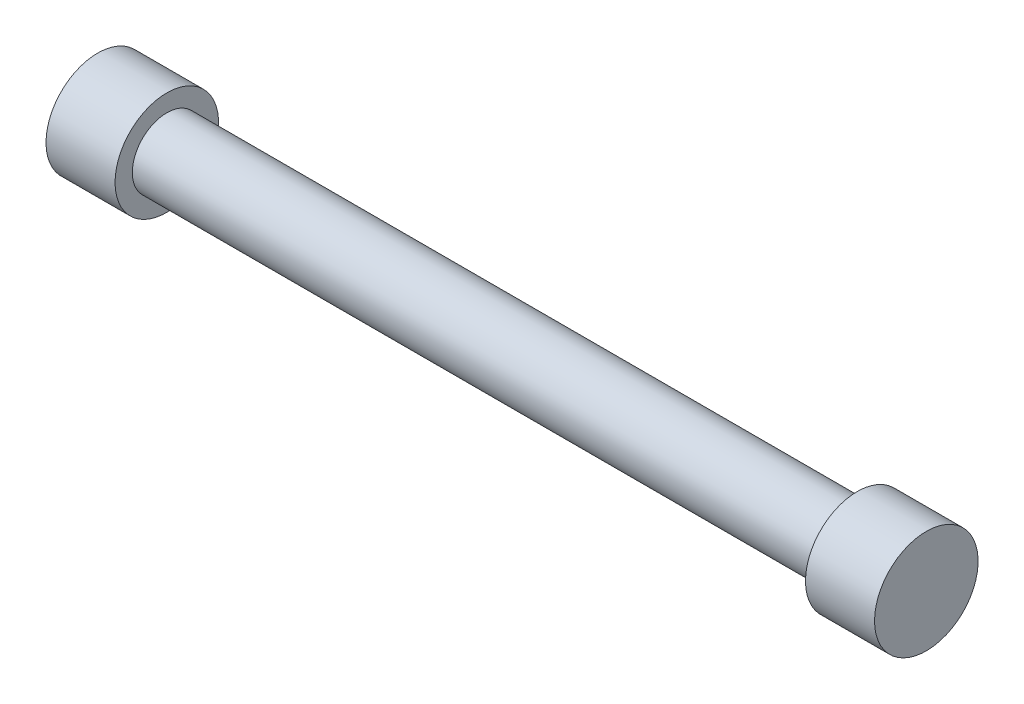
ISO-10303-21;
HEADER;
FILE_DESCRIPTION(('STEP AP214'),'2;1');
FILE_NAME('part.step','',(''),(''),'','','');
FILE_SCHEMA(('AUTOMOTIVE_DESIGN { 1 0 10303 214 1 1 1 1 }'));
ENDSEC;
DATA;
#1=APPLICATION_CONTEXT('core data for automotive mechanical design processes');
#2=APPLICATION_PROTOCOL_DEFINITION('international standard','automotive_design',2000,#1);
#3=PRODUCT_CONTEXT('',#1,'mechanical');
#4=PRODUCT('Part','Part','',(#3));
#5=PRODUCT_RELATED_PRODUCT_CATEGORY('part','',(#4));
#6=PRODUCT_DEFINITION_FORMATION('','',#4);
#7=PRODUCT_DEFINITION_CONTEXT('part definition',#1,'design');
#8=PRODUCT_DEFINITION('design','',#6,#7);
#9=PRODUCT_DEFINITION_SHAPE('','',#8);
#10=(LENGTH_UNIT() NAMED_UNIT(*) SI_UNIT(.MILLI.,.METRE.));
#11=(NAMED_UNIT(*) PLANE_ANGLE_UNIT() SI_UNIT($,.RADIAN.));
#12=(NAMED_UNIT(*) SI_UNIT($,.STERADIAN.) SOLID_ANGLE_UNIT());
#13=UNCERTAINTY_MEASURE_WITH_UNIT(LENGTH_MEASURE(1.E-05),#10,'distance_accuracy_value','');
#14=(GEOMETRIC_REPRESENTATION_CONTEXT(3) GLOBAL_UNCERTAINTY_ASSIGNED_CONTEXT((#13)) GLOBAL_UNIT_ASSIGNED_CONTEXT((#10,
#11,#12)) REPRESENTATION_CONTEXT('',''));
#15=CARTESIAN_POINT('',(0.,0.,0.));
#16=DIRECTION('',(0.,0.,1.));
#17=DIRECTION('',(1.,0.,0.));
#18=AXIS2_PLACEMENT_3D('',#15,#16,#17);
#19=CARTESIAN_POINT('',(0.,0.,0.));
#20=DIRECTION('',(-1.,0.,0.));
#21=DIRECTION('',(0.,0.,1.));
#22=AXIS2_PLACEMENT_3D('',#19,#20,#21);
#23=PLANE('',#22);
#24=CARTESIAN_POINT('',(0.,0.,0.));
#25=DIRECTION('',(-1.,0.,0.));
#26=DIRECTION('',(0.,0.,1.));
#27=AXIS2_PLACEMENT_3D('',#24,#25,#26);
#28=CIRCLE('',#27,1.5);
#29=CARTESIAN_POINT('',(0.,0.,1.5));
#30=VERTEX_POINT('',#29);
#31=EDGE_CURVE('E10',#30,#30,#28,.T.);
#32=ORIENTED_EDGE('',*,*,#31,.T.);
#33=EDGE_LOOP('',(#32));
#34=FACE_BOUND('',#33,.T.);
#35=ADVANCED_FACE('F45',(#34),#23,.T.);
#36=CARTESIAN_POINT('',(0.,0.,0.));
#37=DIRECTION('',(-1.,0.,0.));
#38=DIRECTION('',(0.,0.,1.));
#39=AXIS2_PLACEMENT_3D('',#36,#37,#38);
#40=CYLINDRICAL_SURFACE('',#39,1.5);
#41=CARTESIAN_POINT('',(2.,0.,0.));
#42=DIRECTION('',(-1.,0.,0.));
#43=DIRECTION('',(0.,0.,1.));
#44=AXIS2_PLACEMENT_3D('',#41,#42,#43);
#45=CIRCLE('',#44,1.5);
#46=CARTESIAN_POINT('',(2.,0.,1.5));
#47=VERTEX_POINT('',#46);
#48=EDGE_CURVE('E52',#47,#47,#45,.T.);
#49=ORIENTED_EDGE('',*,*,#48,.T.);
#50=EDGE_LOOP('',(#49));
#51=FACE_BOUND('',#50,.T.);
#52=ORIENTED_EDGE('',*,*,#31,.F.);
#53=EDGE_LOOP('',(#52));
#54=FACE_BOUND('',#53,.T.);
#55=ADVANCED_FACE('F89',(#51,#54),#40,.T.);
#56=CARTESIAN_POINT('',(2.,0.,1.5));
#57=DIRECTION('',(1.,0.,0.));
#58=DIRECTION('',(0.,0.,-1.));
#59=AXIS2_PLACEMENT_3D('',#56,#57,#58);
#60=PLANE('',#59);
#61=CARTESIAN_POINT('',(2.,0.,0.));
#62=DIRECTION('',(-1.,0.,0.));
#63=DIRECTION('',(0.,0.,1.));
#64=AXIS2_PLACEMENT_3D('',#61,#62,#63);
#65=CIRCLE('',#64,1.);
#66=CARTESIAN_POINT('',(2.,0.,1.));
#67=VERTEX_POINT('',#66);
#68=EDGE_CURVE('E57',#67,#67,#65,.T.);
#69=ORIENTED_EDGE('',*,*,#68,.T.);
#70=EDGE_LOOP('',(#69));
#71=FACE_BOUND('',#70,.T.);
#72=ORIENTED_EDGE('',*,*,#48,.F.);
#73=EDGE_LOOP('',(#72));
#74=FACE_BOUND('',#73,.T.);
#75=ADVANCED_FACE('F93',(#71,#74),#60,.T.);
#76=CARTESIAN_POINT('',(0.,0.,0.));
#77=DIRECTION('',(-1.,0.,0.));
#78=DIRECTION('',(0.,0.,1.));
#79=AXIS2_PLACEMENT_3D('',#76,#77,#78);
#80=CYLINDRICAL_SURFACE('',#79,1.);
#81=CARTESIAN_POINT('',(22.,0.,0.));
#82=DIRECTION('',(-1.,0.,0.));
#83=DIRECTION('',(0.,0.,1.));
#84=AXIS2_PLACEMENT_3D('',#81,#82,#83);
#85=CIRCLE('',#84,1.);
#86=CARTESIAN_POINT('',(22.,0.,1.));
#87=VERTEX_POINT('',#86);
#88=EDGE_CURVE('E62',#87,#87,#85,.T.);
#89=ORIENTED_EDGE('',*,*,#88,.T.);
#90=EDGE_LOOP('',(#89));
#91=FACE_BOUND('',#90,.T.);
#92=ORIENTED_EDGE('',*,*,#68,.F.);
#93=EDGE_LOOP('',(#92));
#94=FACE_BOUND('',#93,.T.);
#95=ADVANCED_FACE('F97',(#91,#94),#80,.T.);
#96=CARTESIAN_POINT('',(22.,0.,1.));
#97=DIRECTION('',(-1.,0.,0.));
#98=DIRECTION('',(0.,0.,1.));
#99=AXIS2_PLACEMENT_3D('',#96,#97,#98);
#100=PLANE('',#99);
#101=CARTESIAN_POINT('',(22.,0.,0.));
#102=DIRECTION('',(-1.,0.,0.));
#103=DIRECTION('',(0.,0.,1.));
#104=AXIS2_PLACEMENT_3D('',#101,#102,#103);
#105=CIRCLE('',#104,1.5);
#106=CARTESIAN_POINT('',(22.,0.,1.5));
#107=VERTEX_POINT('',#106);
#108=EDGE_CURVE('E68',#107,#107,#105,.T.);
#109=ORIENTED_EDGE('',*,*,#108,.T.);
#110=EDGE_LOOP('',(#109));
#111=FACE_BOUND('',#110,.T.);
#112=ORIENTED_EDGE('',*,*,#88,.F.);
#113=EDGE_LOOP('',(#112));
#114=FACE_BOUND('',#113,.T.);
#115=ADVANCED_FACE('F86',(#111,#114),#100,.T.);
#116=CARTESIAN_POINT('',(0.,0.,0.));
#117=DIRECTION('',(-1.,0.,0.));
#118=DIRECTION('',(0.,0.,1.));
#119=AXIS2_PLACEMENT_3D('',#116,#117,#118);
#120=CYLINDRICAL_SURFACE('',#119,1.5);
#121=CARTESIAN_POINT('',(24.,0.,0.));
#122=DIRECTION('',(-1.,0.,0.));
#123=DIRECTION('',(0.,0.,1.));
#124=AXIS2_PLACEMENT_3D('',#121,#122,#123);
#125=CIRCLE('',#124,1.5);
#126=CARTESIAN_POINT('',(24.,0.,1.5));
#127=VERTEX_POINT('',#126);
#128=EDGE_CURVE('E72',#127,#127,#125,.T.);
#129=ORIENTED_EDGE('',*,*,#128,.T.);
#130=EDGE_LOOP('',(#129));
#131=FACE_BOUND('',#130,.T.);
#132=ORIENTED_EDGE('',*,*,#108,.F.);
#133=EDGE_LOOP('',(#132));
#134=FACE_BOUND('',#133,.T.);
#135=ADVANCED_FACE('F77',(#131,#134),#120,.T.);
#136=CARTESIAN_POINT('',(24.,0.,1.5));
#137=DIRECTION('',(1.,0.,0.));
#138=DIRECTION('',(0.,0.,-1.));
#139=AXIS2_PLACEMENT_3D('',#136,#137,#138);
#140=PLANE('',#139);
#141=ORIENTED_EDGE('',*,*,#128,.F.);
#142=EDGE_LOOP('',(#141));
#143=FACE_BOUND('',#142,.T.);
#144=ADVANCED_FACE('F80',(#143),#140,.T.);
#145=CLOSED_SHELL('',(#35,#55,#75,#95,#115,#135,#144));
#146=MANIFOLD_SOLID_BREP('B2',#145);
#147=ADVANCED_BREP_SHAPE_REPRESENTATION('',(#18,#146),#14);
#148=SHAPE_DEFINITION_REPRESENTATION(#9,#147);
ENDSEC;
END-ISO-10303-21;
